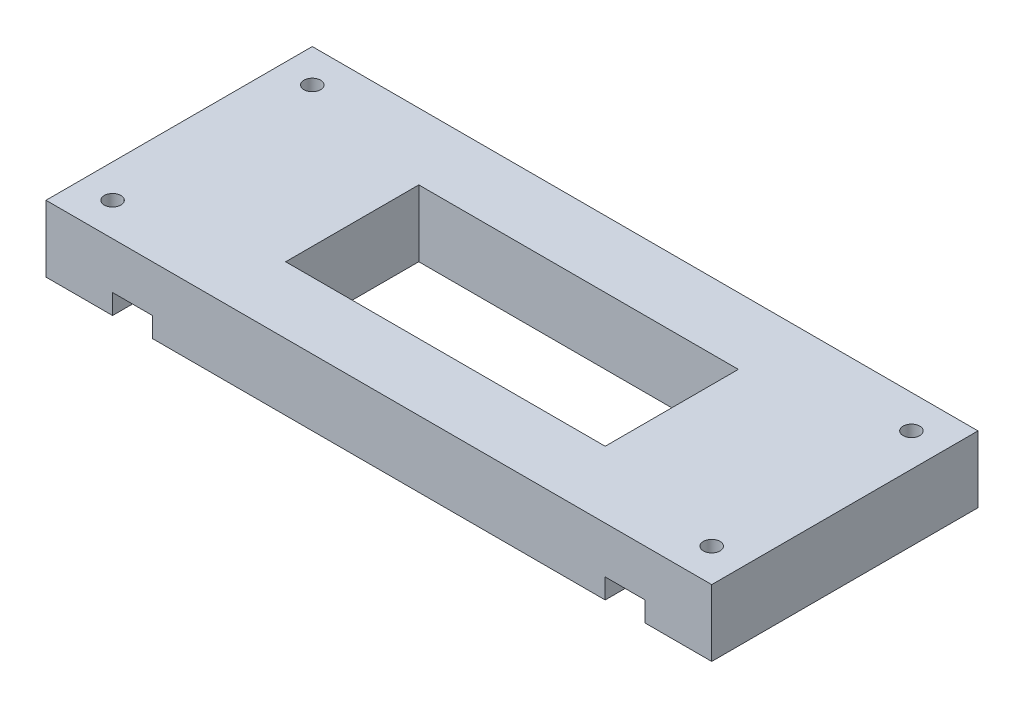
ISO-10303-21;
HEADER;
FILE_DESCRIPTION(('STEP AP214'),'2;1');
FILE_NAME('part.step','',(''),(''),'','','');
FILE_SCHEMA(('AUTOMOTIVE_DESIGN { 1 0 10303 214 1 1 1 1 }'));
ENDSEC;
DATA;
#1=APPLICATION_CONTEXT('core data for automotive mechanical design processes');
#2=APPLICATION_PROTOCOL_DEFINITION('international standard','automotive_design',2000,#1);
#3=PRODUCT_CONTEXT('',#1,'mechanical');
#4=PRODUCT('Part','Part','',(#3));
#5=PRODUCT_RELATED_PRODUCT_CATEGORY('part','',(#4));
#6=PRODUCT_DEFINITION_FORMATION('','',#4);
#7=PRODUCT_DEFINITION_CONTEXT('part definition',#1,'design');
#8=PRODUCT_DEFINITION('design','',#6,#7);
#9=PRODUCT_DEFINITION_SHAPE('','',#8);
#10=(LENGTH_UNIT() NAMED_UNIT(*) SI_UNIT(.MILLI.,.METRE.));
#11=(NAMED_UNIT(*) PLANE_ANGLE_UNIT() SI_UNIT($,.RADIAN.));
#12=(NAMED_UNIT(*) SI_UNIT($,.STERADIAN.) SOLID_ANGLE_UNIT());
#13=UNCERTAINTY_MEASURE_WITH_UNIT(LENGTH_MEASURE(1.E-05),#10,'distance_accuracy_value','');
#14=(GEOMETRIC_REPRESENTATION_CONTEXT(3) GLOBAL_UNCERTAINTY_ASSIGNED_CONTEXT((#13)) GLOBAL_UNIT_ASSIGNED_CONTEXT((#10,
#11,#12)) REPRESENTATION_CONTEXT('',''));
#15=CARTESIAN_POINT('',(0.,0.,0.));
#16=DIRECTION('',(0.,0.,1.));
#17=DIRECTION('',(1.,0.,0.));
#18=AXIS2_PLACEMENT_3D('',#15,#16,#17);
#19=CARTESIAN_POINT('',(0.,10.,40.));
#20=DIRECTION('',(1.,0.,0.));
#21=DIRECTION('',(0.,1.,0.));
#22=AXIS2_PLACEMENT_3D('',#19,#20,#21);
#23=PLANE('',#22);
#24=DIRECTION('',(0.,-1.,0.));
#25=VECTOR('',#24,1.);
#26=CARTESIAN_POINT('',(0.,10.,0.));
#27=LINE('',#26,#25);
#28=CARTESIAN_POINT('',(0.,10.,0.));
#29=VERTEX_POINT('',#28);
#30=CARTESIAN_POINT('',(0.,0.,0.));
#31=VERTEX_POINT('',#30);
#32=EDGE_CURVE('E168',#29,#31,#27,.T.);
#33=ORIENTED_EDGE('',*,*,#32,.T.);
#34=DIRECTION('',(0.,0.,-1.));
#35=VECTOR('',#34,1.);
#36=CARTESIAN_POINT('',(0.,0.,40.));
#37=LINE('',#36,#35);
#38=CARTESIAN_POINT('',(0.,0.,40.));
#39=VERTEX_POINT('',#38);
#40=EDGE_CURVE('E11',#39,#31,#37,.T.);
#41=ORIENTED_EDGE('',*,*,#40,.F.);
#42=DIRECTION('',(0.,-1.,0.));
#43=VECTOR('',#42,1.);
#44=CARTESIAN_POINT('',(0.,10.,40.));
#45=LINE('',#44,#43);
#46=CARTESIAN_POINT('',(0.,10.,40.));
#47=VERTEX_POINT('',#46);
#48=EDGE_CURVE('E200',#47,#39,#45,.T.);
#49=ORIENTED_EDGE('',*,*,#48,.F.);
#50=DIRECTION('',(0.,0.,-1.));
#51=VECTOR('',#50,1.);
#52=CARTESIAN_POINT('',(0.,10.,40.));
#53=LINE('',#52,#51);
#54=EDGE_CURVE('E238',#47,#29,#53,.T.);
#55=ORIENTED_EDGE('',*,*,#54,.T.);
#56=EDGE_LOOP('',(#33,#41,#49,#55));
#57=FACE_BOUND('',#56,.T.);
#58=ADVANCED_FACE('F39',(#57),#23,.F.);
#59=CARTESIAN_POINT('',(0.,0.,40.));
#60=DIRECTION('',(0.,1.,0.));
#61=DIRECTION('',(0.,0.,1.));
#62=AXIS2_PLACEMENT_3D('',#59,#60,#61);
#63=PLANE('',#62);
#64=CARTESIAN_POINT('',(5.,0.,5.));
#65=DIRECTION('',(0.,-1.,0.));
#66=DIRECTION('',(0.,0.,-1.));
#67=AXIS2_PLACEMENT_3D('',#64,#65,#66);
#68=CIRCLE('',#67,1.25);
#69=CARTESIAN_POINT('',(5.,0.,3.75));
#70=VERTEX_POINT('',#69);
#71=EDGE_CURVE('E557',#70,#70,#68,.T.);
#72=ORIENTED_EDGE('',*,*,#71,.F.);
#73=EDGE_LOOP('',(#72));
#74=FACE_BOUND('',#73,.T.);
#75=CARTESIAN_POINT('',(5.,0.,35.));
#76=DIRECTION('',(0.,-1.,0.));
#77=DIRECTION('',(0.,0.,-1.));
#78=AXIS2_PLACEMENT_3D('',#75,#76,#77);
#79=CIRCLE('',#78,1.25);
#80=CARTESIAN_POINT('',(5.,0.,33.75));
#81=VERTEX_POINT('',#80);
#82=EDGE_CURVE('E562',#81,#81,#79,.T.);
#83=ORIENTED_EDGE('',*,*,#82,.F.);
#84=EDGE_LOOP('',(#83));
#85=FACE_BOUND('',#84,.T.);
#86=DIRECTION('',(1.,0.,0.));
#87=VECTOR('',#86,1.);
#88=CARTESIAN_POINT('',(0.,0.,0.));
#89=LINE('',#88,#87);
#90=CARTESIAN_POINT('',(10.,0.,0.));
#91=VERTEX_POINT('',#90);
#92=EDGE_CURVE('E242',#31,#91,#89,.T.);
#93=ORIENTED_EDGE('',*,*,#92,.T.);
#94=DIRECTION('',(0.,0.,-1.));
#95=VECTOR('',#94,1.);
#96=CARTESIAN_POINT('',(10.,0.,40.));
#97=LINE('',#96,#95);
#98=CARTESIAN_POINT('',(10.,0.,40.));
#99=VERTEX_POINT('',#98);
#100=EDGE_CURVE('E47',#99,#91,#97,.T.);
#101=ORIENTED_EDGE('',*,*,#100,.F.);
#102=DIRECTION('',(1.,0.,0.));
#103=VECTOR('',#102,1.);
#104=CARTESIAN_POINT('',(0.,0.,40.));
#105=LINE('',#104,#103);
#106=EDGE_CURVE('E204',#39,#99,#105,.T.);
#107=ORIENTED_EDGE('',*,*,#106,.F.);
#108=ORIENTED_EDGE('',*,*,#40,.T.);
#109=EDGE_LOOP('',(#93,#101,#107,#108));
#110=FACE_BOUND('',#109,.T.);
#111=ADVANCED_FACE('F341',(#74,#85,#110),#63,.F.);
#112=CARTESIAN_POINT('',(10.,0.,40.));
#113=DIRECTION('',(-1.,0.,0.));
#114=DIRECTION('',(0.,0.,1.));
#115=AXIS2_PLACEMENT_3D('',#112,#113,#114);
#116=PLANE('',#115);
#117=DIRECTION('',(0.,1.,0.));
#118=VECTOR('',#117,1.);
#119=CARTESIAN_POINT('',(10.,0.,0.));
#120=LINE('',#119,#118);
#121=CARTESIAN_POINT('',(10.,3.,0.));
#122=VERTEX_POINT('',#121);
#123=EDGE_CURVE('E245',#91,#122,#120,.T.);
#124=ORIENTED_EDGE('',*,*,#123,.T.);
#125=DIRECTION('',(0.,0.,-1.));
#126=VECTOR('',#125,1.);
#127=CARTESIAN_POINT('',(10.,3.,40.));
#128=LINE('',#127,#126);
#129=CARTESIAN_POINT('',(10.,3.,40.));
#130=VERTEX_POINT('',#129);
#131=EDGE_CURVE('E309',#130,#122,#128,.T.);
#132=ORIENTED_EDGE('',*,*,#131,.F.);
#133=DIRECTION('',(0.,1.,0.));
#134=VECTOR('',#133,1.);
#135=CARTESIAN_POINT('',(10.,0.,40.));
#136=LINE('',#135,#134);
#137=EDGE_CURVE('E208',#99,#130,#136,.T.);
#138=ORIENTED_EDGE('',*,*,#137,.F.);
#139=ORIENTED_EDGE('',*,*,#100,.T.);
#140=EDGE_LOOP('',(#124,#132,#138,#139));
#141=FACE_BOUND('',#140,.T.);
#142=ADVANCED_FACE('F318',(#141),#116,.F.);
#143=CARTESIAN_POINT('',(10.,3.,40.));
#144=DIRECTION('',(0.,1.,0.));
#145=DIRECTION('',(0.,0.,1.));
#146=AXIS2_PLACEMENT_3D('',#143,#144,#145);
#147=PLANE('',#146);
#148=DIRECTION('',(1.,0.,0.));
#149=VECTOR('',#148,1.);
#150=CARTESIAN_POINT('',(10.,3.,0.));
#151=LINE('',#150,#149);
#152=CARTESIAN_POINT('',(16.,3.,0.));
#153=VERTEX_POINT('',#152);
#154=EDGE_CURVE('E248',#122,#153,#151,.T.);
#155=ORIENTED_EDGE('',*,*,#154,.T.);
#156=DIRECTION('',(0.,0.,-1.));
#157=VECTOR('',#156,1.);
#158=CARTESIAN_POINT('',(16.,3.,40.));
#159=LINE('',#158,#157);
#160=CARTESIAN_POINT('',(16.,3.,40.));
#161=VERTEX_POINT('',#160);
#162=EDGE_CURVE('E305',#161,#153,#159,.T.);
#163=ORIENTED_EDGE('',*,*,#162,.F.);
#164=DIRECTION('',(1.,0.,0.));
#165=VECTOR('',#164,1.);
#166=CARTESIAN_POINT('',(10.,3.,40.));
#167=LINE('',#166,#165);
#168=EDGE_CURVE('E211',#130,#161,#167,.T.);
#169=ORIENTED_EDGE('',*,*,#168,.F.);
#170=ORIENTED_EDGE('',*,*,#131,.T.);
#171=EDGE_LOOP('',(#155,#163,#169,#170));
#172=FACE_BOUND('',#171,.T.);
#173=ADVANCED_FACE('F329',(#172),#147,.F.);
#174=CARTESIAN_POINT('',(16.,3.,40.));
#175=DIRECTION('',(1.,0.,0.));
#176=DIRECTION('',(0.,0.,-1.));
#177=AXIS2_PLACEMENT_3D('',#174,#175,#176);
#178=PLANE('',#177);
#179=DIRECTION('',(0.,-1.,0.));
#180=VECTOR('',#179,1.);
#181=CARTESIAN_POINT('',(16.,3.,0.));
#182=LINE('',#181,#180);
#183=CARTESIAN_POINT('',(16.,0.,0.));
#184=VERTEX_POINT('',#183);
#185=EDGE_CURVE('E251',#153,#184,#182,.T.);
#186=ORIENTED_EDGE('',*,*,#185,.T.);
#187=DIRECTION('',(0.,0.,-1.));
#188=VECTOR('',#187,1.);
#189=CARTESIAN_POINT('',(16.,0.,40.));
#190=LINE('',#189,#188);
#191=CARTESIAN_POINT('',(16.,0.,40.));
#192=VERTEX_POINT('',#191);
#193=EDGE_CURVE('E301',#192,#184,#190,.T.);
#194=ORIENTED_EDGE('',*,*,#193,.F.);
#195=DIRECTION('',(0.,-1.,0.));
#196=VECTOR('',#195,1.);
#197=CARTESIAN_POINT('',(16.,3.,40.));
#198=LINE('',#197,#196);
#199=EDGE_CURVE('E214',#161,#192,#198,.T.);
#200=ORIENTED_EDGE('',*,*,#199,.F.);
#201=ORIENTED_EDGE('',*,*,#162,.T.);
#202=EDGE_LOOP('',(#186,#194,#200,#201));
#203=FACE_BOUND('',#202,.T.);
#204=ADVANCED_FACE('F333',(#203),#178,.F.);
#205=CARTESIAN_POINT('',(16.,0.,40.));
#206=DIRECTION('',(0.,1.,0.));
#207=DIRECTION('',(0.,0.,1.));
#208=AXIS2_PLACEMENT_3D('',#205,#206,#207);
#209=PLANE('',#208);
#210=DIRECTION('',(1.,0.,0.));
#211=VECTOR('',#210,1.);
#212=CARTESIAN_POINT('',(26.,0.,10.));
#213=LINE('',#212,#211);
#214=CARTESIAN_POINT('',(26.,0.,10.));
#215=VERTEX_POINT('',#214);
#216=CARTESIAN_POINT('',(74.,0.,10.));
#217=VERTEX_POINT('',#216);
#218=EDGE_CURVE('E174',#215,#217,#213,.T.);
#219=ORIENTED_EDGE('',*,*,#218,.F.);
#220=DIRECTION('',(0.,0.,-1.));
#221=VECTOR('',#220,1.);
#222=CARTESIAN_POINT('',(26.,0.,10.));
#223=LINE('',#222,#221);
#224=CARTESIAN_POINT('',(26.,0.,30.));
#225=VERTEX_POINT('',#224);
#226=EDGE_CURVE('E154',#225,#215,#223,.T.);
#227=ORIENTED_EDGE('',*,*,#226,.F.);
#228=DIRECTION('',(-1.,0.,0.));
#229=VECTOR('',#228,1.);
#230=CARTESIAN_POINT('',(26.,0.,30.));
#231=LINE('',#230,#229);
#232=CARTESIAN_POINT('',(74.,0.,30.));
#233=VERTEX_POINT('',#232);
#234=EDGE_CURVE('E164',#233,#225,#231,.T.);
#235=ORIENTED_EDGE('',*,*,#234,.F.);
#236=DIRECTION('',(0.,0.,1.));
#237=VECTOR('',#236,1.);
#238=CARTESIAN_POINT('',(74.,0.,10.));
#239=LINE('',#238,#237);
#240=EDGE_CURVE('E54',#217,#233,#239,.T.);
#241=ORIENTED_EDGE('',*,*,#240,.F.);
#242=EDGE_LOOP('',(#219,#227,#235,#241));
#243=FACE_BOUND('',#242,.T.);
#244=DIRECTION('',(1.,0.,0.));
#245=VECTOR('',#244,1.);
#246=CARTESIAN_POINT('',(16.,0.,0.));
#247=LINE('',#246,#245);
#248=CARTESIAN_POINT('',(84.,0.,0.));
#249=VERTEX_POINT('',#248);
#250=EDGE_CURVE('E254',#184,#249,#247,.T.);
#251=ORIENTED_EDGE('',*,*,#250,.T.);
#252=DIRECTION('',(0.,0.,-1.));
#253=VECTOR('',#252,1.);
#254=CARTESIAN_POINT('',(84.,0.,40.));
#255=LINE('',#254,#253);
#256=CARTESIAN_POINT('',(84.,0.,40.));
#257=VERTEX_POINT('',#256);
#258=EDGE_CURVE('E297',#257,#249,#255,.T.);
#259=ORIENTED_EDGE('',*,*,#258,.F.);
#260=DIRECTION('',(1.,0.,0.));
#261=VECTOR('',#260,1.);
#262=CARTESIAN_POINT('',(16.,0.,40.));
#263=LINE('',#262,#261);
#264=EDGE_CURVE('E217',#192,#257,#263,.T.);
#265=ORIENTED_EDGE('',*,*,#264,.F.);
#266=ORIENTED_EDGE('',*,*,#193,.T.);
#267=EDGE_LOOP('',(#251,#259,#265,#266));
#268=FACE_BOUND('',#267,.T.);
#269=ADVANCED_FACE('F171',(#243,#268),#209,.F.);
#270=CARTESIAN_POINT('',(84.,0.,40.));
#271=DIRECTION('',(-1.,0.,0.));
#272=DIRECTION('',(0.,0.,1.));
#273=AXIS2_PLACEMENT_3D('',#270,#271,#272);
#274=PLANE('',#273);
#275=DIRECTION('',(0.,1.,0.));
#276=VECTOR('',#275,1.);
#277=CARTESIAN_POINT('',(84.,0.,0.));
#278=LINE('',#277,#276);
#279=CARTESIAN_POINT('',(84.,3.,0.));
#280=VERTEX_POINT('',#279);
#281=EDGE_CURVE('E257',#249,#280,#278,.T.);
#282=ORIENTED_EDGE('',*,*,#281,.T.);
#283=DIRECTION('',(0.,0.,-1.));
#284=VECTOR('',#283,1.);
#285=CARTESIAN_POINT('',(84.,3.,40.));
#286=LINE('',#285,#284);
#287=CARTESIAN_POINT('',(84.,3.,40.));
#288=VERTEX_POINT('',#287);
#289=EDGE_CURVE('E293',#288,#280,#286,.T.);
#290=ORIENTED_EDGE('',*,*,#289,.F.);
#291=DIRECTION('',(0.,1.,0.));
#292=VECTOR('',#291,1.);
#293=CARTESIAN_POINT('',(84.,0.,40.));
#294=LINE('',#293,#292);
#295=EDGE_CURVE('E220',#257,#288,#294,.T.);
#296=ORIENTED_EDGE('',*,*,#295,.F.);
#297=ORIENTED_EDGE('',*,*,#258,.T.);
#298=EDGE_LOOP('',(#282,#290,#296,#297));
#299=FACE_BOUND('',#298,.T.);
#300=ADVANCED_FACE('F372',(#299),#274,.F.);
#301=CARTESIAN_POINT('',(84.,3.,40.));
#302=DIRECTION('',(0.,1.,0.));
#303=DIRECTION('',(-1.,0.,0.));
#304=AXIS2_PLACEMENT_3D('',#301,#302,#303);
#305=PLANE('',#304);
#306=DIRECTION('',(1.,0.,0.));
#307=VECTOR('',#306,1.);
#308=CARTESIAN_POINT('',(84.,3.,0.));
#309=LINE('',#308,#307);
#310=CARTESIAN_POINT('',(90.,3.,0.));
#311=VERTEX_POINT('',#310);
#312=EDGE_CURVE('E260',#280,#311,#309,.T.);
#313=ORIENTED_EDGE('',*,*,#312,.T.);
#314=DIRECTION('',(0.,0.,-1.));
#315=VECTOR('',#314,1.);
#316=CARTESIAN_POINT('',(90.,3.,40.));
#317=LINE('',#316,#315);
#318=CARTESIAN_POINT('',(90.,3.,40.));
#319=VERTEX_POINT('',#318);
#320=EDGE_CURVE('E289',#319,#311,#317,.T.);
#321=ORIENTED_EDGE('',*,*,#320,.F.);
#322=DIRECTION('',(1.,0.,0.));
#323=VECTOR('',#322,1.);
#324=CARTESIAN_POINT('',(84.,3.,40.));
#325=LINE('',#324,#323);
#326=EDGE_CURVE('E223',#288,#319,#325,.T.);
#327=ORIENTED_EDGE('',*,*,#326,.F.);
#328=ORIENTED_EDGE('',*,*,#289,.T.);
#329=EDGE_LOOP('',(#313,#321,#327,#328));
#330=FACE_BOUND('',#329,.T.);
#331=ADVANCED_FACE('F368',(#330),#305,.F.);
#332=CARTESIAN_POINT('',(90.,3.,40.));
#333=DIRECTION('',(1.,0.,0.));
#334=DIRECTION('',(0.,0.,-1.));
#335=AXIS2_PLACEMENT_3D('',#332,#333,#334);
#336=PLANE('',#335);
#337=DIRECTION('',(0.,-1.,0.));
#338=VECTOR('',#337,1.);
#339=CARTESIAN_POINT('',(90.,3.,0.));
#340=LINE('',#339,#338);
#341=CARTESIAN_POINT('',(90.,0.,0.));
#342=VERTEX_POINT('',#341);
#343=EDGE_CURVE('E263',#311,#342,#340,.T.);
#344=ORIENTED_EDGE('',*,*,#343,.T.);
#345=DIRECTION('',(0.,0.,-1.));
#346=VECTOR('',#345,1.);
#347=CARTESIAN_POINT('',(90.,0.,40.));
#348=LINE('',#347,#346);
#349=CARTESIAN_POINT('',(90.,0.,40.));
#350=VERTEX_POINT('',#349);
#351=EDGE_CURVE('E285',#350,#342,#348,.T.);
#352=ORIENTED_EDGE('',*,*,#351,.F.);
#353=DIRECTION('',(0.,-1.,0.));
#354=VECTOR('',#353,1.);
#355=CARTESIAN_POINT('',(90.,3.,40.));
#356=LINE('',#355,#354);
#357=EDGE_CURVE('E226',#319,#350,#356,.T.);
#358=ORIENTED_EDGE('',*,*,#357,.F.);
#359=ORIENTED_EDGE('',*,*,#320,.T.);
#360=EDGE_LOOP('',(#344,#352,#358,#359));
#361=FACE_BOUND('',#360,.T.);
#362=ADVANCED_FACE('F363',(#361),#336,.F.);
#363=CARTESIAN_POINT('',(90.,0.,40.));
#364=DIRECTION('',(0.,1.,0.));
#365=DIRECTION('',(0.,0.,1.));
#366=AXIS2_PLACEMENT_3D('',#363,#364,#365);
#367=PLANE('',#366);
#368=CARTESIAN_POINT('',(95.,0.,35.));
#369=DIRECTION('',(0.,-1.,0.));
#370=DIRECTION('',(0.,0.,-1.));
#371=AXIS2_PLACEMENT_3D('',#368,#369,#370);
#372=CIRCLE('',#371,1.25);
#373=CARTESIAN_POINT('',(95.,0.,33.75));
#374=VERTEX_POINT('',#373);
#375=EDGE_CURVE('E573',#374,#374,#372,.T.);
#376=ORIENTED_EDGE('',*,*,#375,.F.);
#377=EDGE_LOOP('',(#376));
#378=FACE_BOUND('',#377,.T.);
#379=CARTESIAN_POINT('',(95.,0.,5.));
#380=DIRECTION('',(0.,-1.,0.));
#381=DIRECTION('',(0.,0.,-1.));
#382=AXIS2_PLACEMENT_3D('',#379,#380,#381);
#383=CIRCLE('',#382,1.25);
#384=CARTESIAN_POINT('',(95.,0.,3.75));
#385=VERTEX_POINT('',#384);
#386=EDGE_CURVE('E598',#385,#385,#383,.T.);
#387=ORIENTED_EDGE('',*,*,#386,.F.);
#388=EDGE_LOOP('',(#387));
#389=FACE_BOUND('',#388,.T.);
#390=DIRECTION('',(1.,0.,0.));
#391=VECTOR('',#390,1.);
#392=CARTESIAN_POINT('',(90.,0.,0.));
#393=LINE('',#392,#391);
#394=CARTESIAN_POINT('',(100.,0.,0.));
#395=VERTEX_POINT('',#394);
#396=EDGE_CURVE('E266',#342,#395,#393,.T.);
#397=ORIENTED_EDGE('',*,*,#396,.T.);
#398=DIRECTION('',(0.,0.,-1.));
#399=VECTOR('',#398,1.);
#400=CARTESIAN_POINT('',(100.,0.,40.));
#401=LINE('',#400,#399);
#402=CARTESIAN_POINT('',(100.,0.,40.));
#403=VERTEX_POINT('',#402);
#404=EDGE_CURVE('E281',#403,#395,#401,.T.);
#405=ORIENTED_EDGE('',*,*,#404,.F.);
#406=DIRECTION('',(1.,0.,0.));
#407=VECTOR('',#406,1.);
#408=CARTESIAN_POINT('',(90.,0.,40.));
#409=LINE('',#408,#407);
#410=EDGE_CURVE('E229',#350,#403,#409,.T.);
#411=ORIENTED_EDGE('',*,*,#410,.F.);
#412=ORIENTED_EDGE('',*,*,#351,.T.);
#413=EDGE_LOOP('',(#397,#405,#411,#412));
#414=FACE_BOUND('',#413,.T.);
#415=ADVANCED_FACE('F357',(#378,#389,#414),#367,.F.);
#416=CARTESIAN_POINT('',(100.,10.,40.));
#417=DIRECTION('',(-1.,0.,0.));
#418=DIRECTION('',(0.,0.,1.));
#419=AXIS2_PLACEMENT_3D('',#416,#417,#418);
#420=PLANE('',#419);
#421=DIRECTION('',(0.,1.,0.));
#422=VECTOR('',#421,1.);
#423=CARTESIAN_POINT('',(100.,10.,0.));
#424=LINE('',#423,#422);
#425=CARTESIAN_POINT('',(100.,10.,0.));
#426=VERTEX_POINT('',#425);
#427=EDGE_CURVE('E269',#395,#426,#424,.T.);
#428=ORIENTED_EDGE('',*,*,#427,.T.);
#429=DIRECTION('',(0.,0.,-1.));
#430=VECTOR('',#429,1.);
#431=CARTESIAN_POINT('',(100.,10.,40.));
#432=LINE('',#431,#430);
#433=CARTESIAN_POINT('',(100.,10.,40.));
#434=VERTEX_POINT('',#433);
#435=EDGE_CURVE('E277',#434,#426,#432,.T.);
#436=ORIENTED_EDGE('',*,*,#435,.F.);
#437=DIRECTION('',(0.,1.,0.));
#438=VECTOR('',#437,1.);
#439=CARTESIAN_POINT('',(100.,10.,40.));
#440=LINE('',#439,#438);
#441=EDGE_CURVE('E232',#403,#434,#440,.T.);
#442=ORIENTED_EDGE('',*,*,#441,.F.);
#443=ORIENTED_EDGE('',*,*,#404,.T.);
#444=EDGE_LOOP('',(#428,#436,#442,#443));
#445=FACE_BOUND('',#444,.T.);
#446=ADVANCED_FACE('F353',(#445),#420,.F.);
#447=CARTESIAN_POINT('',(0.,10.,40.));
#448=DIRECTION('',(0.,-1.,0.));
#449=DIRECTION('',(0.,0.,-1.));
#450=AXIS2_PLACEMENT_3D('',#447,#448,#449);
#451=PLANE('',#450);
#452=CARTESIAN_POINT('',(5.,10.,5.));
#453=DIRECTION('',(0.,-1.,0.));
#454=DIRECTION('',(0.,0.,-1.));
#455=AXIS2_PLACEMENT_3D('',#452,#453,#454);
#456=CIRCLE('',#455,1.25);
#457=CARTESIAN_POINT('',(5.,10.,3.75));
#458=VERTEX_POINT('',#457);
#459=EDGE_CURVE('E560',#458,#458,#456,.F.);
#460=ORIENTED_EDGE('',*,*,#459,.F.);
#461=EDGE_LOOP('',(#460));
#462=FACE_BOUND('',#461,.T.);
#463=CARTESIAN_POINT('',(95.,10.,35.));
#464=DIRECTION('',(0.,-1.,0.));
#465=DIRECTION('',(0.,0.,-1.));
#466=AXIS2_PLACEMENT_3D('',#463,#464,#465);
#467=CIRCLE('',#466,1.25);
#468=CARTESIAN_POINT('',(95.,10.,33.75));
#469=VERTEX_POINT('',#468);
#470=EDGE_CURVE('E569',#469,#469,#467,.F.);
#471=ORIENTED_EDGE('',*,*,#470,.F.);
#472=EDGE_LOOP('',(#471));
#473=FACE_BOUND('',#472,.T.);
#474=CARTESIAN_POINT('',(95.,10.,5.));
#475=DIRECTION('',(0.,-1.,0.));
#476=DIRECTION('',(0.,0.,-1.));
#477=AXIS2_PLACEMENT_3D('',#474,#475,#476);
#478=CIRCLE('',#477,1.25);
#479=CARTESIAN_POINT('',(95.,10.,3.75));
#480=VERTEX_POINT('',#479);
#481=EDGE_CURVE('E577',#480,#480,#478,.F.);
#482=ORIENTED_EDGE('',*,*,#481,.F.);
#483=EDGE_LOOP('',(#482));
#484=FACE_BOUND('',#483,.T.);
#485=CARTESIAN_POINT('',(5.,10.,35.));
#486=DIRECTION('',(0.,-1.,0.));
#487=DIRECTION('',(0.,0.,-1.));
#488=AXIS2_PLACEMENT_3D('',#485,#486,#487);
#489=CIRCLE('',#488,1.25);
#490=CARTESIAN_POINT('',(5.,10.,33.75));
#491=VERTEX_POINT('',#490);
#492=EDGE_CURVE('E567',#491,#491,#489,.F.);
#493=ORIENTED_EDGE('',*,*,#492,.F.);
#494=EDGE_LOOP('',(#493));
#495=FACE_BOUND('',#494,.T.);
#496=DIRECTION('',(1.,0.,0.));
#497=VECTOR('',#496,1.);
#498=CARTESIAN_POINT('',(26.,10.,30.));
#499=LINE('',#498,#497);
#500=CARTESIAN_POINT('',(26.,10.,30.));
#501=VERTEX_POINT('',#500);
#502=CARTESIAN_POINT('',(74.,10.,30.));
#503=VERTEX_POINT('',#502);
#504=EDGE_CURVE('E179',#501,#503,#499,.T.);
#505=ORIENTED_EDGE('',*,*,#504,.F.);
#506=DIRECTION('',(0.,0.,1.));
#507=VECTOR('',#506,1.);
#508=CARTESIAN_POINT('',(26.,10.,10.));
#509=LINE('',#508,#507);
#510=CARTESIAN_POINT('',(26.,10.,10.));
#511=VERTEX_POINT('',#510);
#512=EDGE_CURVE('E62',#511,#501,#509,.T.);
#513=ORIENTED_EDGE('',*,*,#512,.F.);
#514=DIRECTION('',(-1.,0.,0.));
#515=VECTOR('',#514,1.);
#516=CARTESIAN_POINT('',(26.,10.,10.));
#517=LINE('',#516,#515);
#518=CARTESIAN_POINT('',(74.,10.,10.));
#519=VERTEX_POINT('',#518);
#520=EDGE_CURVE('E161',#519,#511,#517,.T.);
#521=ORIENTED_EDGE('',*,*,#520,.F.);
#522=DIRECTION('',(0.,0.,-1.));
#523=VECTOR('',#522,1.);
#524=CARTESIAN_POINT('',(74.,10.,10.));
#525=LINE('',#524,#523);
#526=EDGE_CURVE('E186',#503,#519,#525,.T.);
#527=ORIENTED_EDGE('',*,*,#526,.F.);
#528=EDGE_LOOP('',(#505,#513,#521,#527));
#529=FACE_BOUND('',#528,.T.);
#530=DIRECTION('',(-1.,0.,0.));
#531=VECTOR('',#530,1.);
#532=CARTESIAN_POINT('',(0.,10.,0.));
#533=LINE('',#532,#531);
#534=EDGE_CURVE('E205',#426,#29,#533,.T.);
#535=ORIENTED_EDGE('',*,*,#534,.T.);
#536=ORIENTED_EDGE('',*,*,#54,.F.);
#537=DIRECTION('',(-1.,0.,0.));
#538=VECTOR('',#537,1.);
#539=CARTESIAN_POINT('',(0.,10.,40.));
#540=LINE('',#539,#538);
#541=EDGE_CURVE('E235',#434,#47,#540,.T.);
#542=ORIENTED_EDGE('',*,*,#541,.F.);
#543=ORIENTED_EDGE('',*,*,#435,.T.);
#544=EDGE_LOOP('',(#535,#536,#542,#543));
#545=FACE_BOUND('',#544,.T.);
#546=ADVANCED_FACE('F348',(#462,#473,#484,#495,#529,#545),#451,.F.);
#547=CARTESIAN_POINT('',(0.,0.,40.));
#548=DIRECTION('',(0.,0.,1.));
#549=DIRECTION('',(1.,0.,0.));
#550=AXIS2_PLACEMENT_3D('',#547,#548,#549);
#551=PLANE('',#550);
#552=ORIENTED_EDGE('',*,*,#48,.T.);
#553=ORIENTED_EDGE('',*,*,#106,.T.);
#554=ORIENTED_EDGE('',*,*,#137,.T.);
#555=ORIENTED_EDGE('',*,*,#168,.T.);
#556=ORIENTED_EDGE('',*,*,#199,.T.);
#557=ORIENTED_EDGE('',*,*,#264,.T.);
#558=ORIENTED_EDGE('',*,*,#295,.T.);
#559=ORIENTED_EDGE('',*,*,#326,.T.);
#560=ORIENTED_EDGE('',*,*,#357,.T.);
#561=ORIENTED_EDGE('',*,*,#410,.T.);
#562=ORIENTED_EDGE('',*,*,#441,.T.);
#563=ORIENTED_EDGE('',*,*,#541,.T.);
#564=EDGE_LOOP('',(#552,#553,#554,#555,#556,#557,#558,#559,#560,#561,#562,#563));
#565=FACE_BOUND('',#564,.T.);
#566=ADVANCED_FACE('F337',(#565),#551,.T.);
#567=CARTESIAN_POINT('',(0.,0.,0.));
#568=DIRECTION('',(0.,0.,1.));
#569=DIRECTION('',(1.,0.,0.));
#570=AXIS2_PLACEMENT_3D('',#567,#568,#569);
#571=PLANE('',#570);
#572=ORIENTED_EDGE('',*,*,#32,.F.);
#573=ORIENTED_EDGE('',*,*,#534,.F.);
#574=ORIENTED_EDGE('',*,*,#427,.F.);
#575=ORIENTED_EDGE('',*,*,#396,.F.);
#576=ORIENTED_EDGE('',*,*,#343,.F.);
#577=ORIENTED_EDGE('',*,*,#312,.F.);
#578=ORIENTED_EDGE('',*,*,#281,.F.);
#579=ORIENTED_EDGE('',*,*,#250,.F.);
#580=ORIENTED_EDGE('',*,*,#185,.F.);
#581=ORIENTED_EDGE('',*,*,#154,.F.);
#582=ORIENTED_EDGE('',*,*,#123,.F.);
#583=ORIENTED_EDGE('',*,*,#92,.F.);
#584=EDGE_LOOP('',(#572,#573,#574,#575,#576,#577,#578,#579,#580,#581,#582,#583));
#585=FACE_BOUND('',#584,.T.);
#586=ADVANCED_FACE('F324',(#585),#571,.F.);
#587=CARTESIAN_POINT('',(26.,-0.000999999999999265,10.));
#588=DIRECTION('',(-1.,0.,0.));
#589=DIRECTION('',(0.,0.,1.));
#590=AXIS2_PLACEMENT_3D('',#587,#588,#589);
#591=PLANE('',#590);
#592=ORIENTED_EDGE('',*,*,#226,.T.);
#593=DIRECTION('',(0.,1.,0.));
#594=VECTOR('',#593,1.);
#595=CARTESIAN_POINT('',(26.,-0.000999999999999265,10.));
#596=LINE('',#595,#594);
#597=EDGE_CURVE('E169',#215,#511,#596,.T.);
#598=ORIENTED_EDGE('',*,*,#597,.T.);
#599=ORIENTED_EDGE('',*,*,#512,.T.);
#600=DIRECTION('',(0.,1.,0.));
#601=VECTOR('',#600,1.);
#602=CARTESIAN_POINT('',(26.,-0.000999999999999265,30.));
#603=LINE('',#602,#601);
#604=EDGE_CURVE('E150',#225,#501,#603,.T.);
#605=ORIENTED_EDGE('',*,*,#604,.F.);
#606=EDGE_LOOP('',(#592,#598,#599,#605));
#607=FACE_BOUND('',#606,.T.);
#608=ADVANCED_FACE('F152',(#607),#591,.F.);
#609=CARTESIAN_POINT('',(26.,-0.000999999999999265,10.));
#610=DIRECTION('',(0.,0.,-1.));
#611=DIRECTION('',(-1.,0.,0.));
#612=AXIS2_PLACEMENT_3D('',#609,#610,#611);
#613=PLANE('',#612);
#614=ORIENTED_EDGE('',*,*,#218,.T.);
#615=DIRECTION('',(0.,1.,0.));
#616=VECTOR('',#615,1.);
#617=CARTESIAN_POINT('',(74.,-0.000999999999999265,10.));
#618=LINE('',#617,#616);
#619=EDGE_CURVE('E195',#217,#519,#618,.T.);
#620=ORIENTED_EDGE('',*,*,#619,.T.);
#621=ORIENTED_EDGE('',*,*,#520,.T.);
#622=ORIENTED_EDGE('',*,*,#597,.F.);
#623=EDGE_LOOP('',(#614,#620,#621,#622));
#624=FACE_BOUND('',#623,.T.);
#625=ADVANCED_FACE('F465',(#624),#613,.F.);
#626=CARTESIAN_POINT('',(74.,-0.000999999999999265,10.));
#627=DIRECTION('',(1.,0.,0.));
#628=DIRECTION('',(0.,0.,-1.));
#629=AXIS2_PLACEMENT_3D('',#626,#627,#628);
#630=PLANE('',#629);
#631=ORIENTED_EDGE('',*,*,#240,.T.);
#632=DIRECTION('',(0.,1.,0.));
#633=VECTOR('',#632,1.);
#634=CARTESIAN_POINT('',(74.,-0.000999999999999265,30.));
#635=LINE('',#634,#633);
#636=EDGE_CURVE('E160',#233,#503,#635,.T.);
#637=ORIENTED_EDGE('',*,*,#636,.T.);
#638=ORIENTED_EDGE('',*,*,#526,.T.);
#639=ORIENTED_EDGE('',*,*,#619,.F.);
#640=EDGE_LOOP('',(#631,#637,#638,#639));
#641=FACE_BOUND('',#640,.T.);
#642=ADVANCED_FACE('F474',(#641),#630,.F.);
#643=CARTESIAN_POINT('',(26.,-0.000999999999999265,30.));
#644=DIRECTION('',(0.,0.,1.));
#645=DIRECTION('',(1.,0.,0.));
#646=AXIS2_PLACEMENT_3D('',#643,#644,#645);
#647=PLANE('',#646);
#648=ORIENTED_EDGE('',*,*,#234,.T.);
#649=ORIENTED_EDGE('',*,*,#604,.T.);
#650=ORIENTED_EDGE('',*,*,#504,.T.);
#651=ORIENTED_EDGE('',*,*,#636,.F.);
#652=EDGE_LOOP('',(#648,#649,#650,#651));
#653=FACE_BOUND('',#652,.T.);
#654=ADVANCED_FACE('F165',(#653),#647,.F.);
#655=CARTESIAN_POINT('',(5.,10.001,35.));
#656=DIRECTION('',(0.,-1.,0.));
#657=DIRECTION('',(0.,0.,-1.));
#658=AXIS2_PLACEMENT_3D('',#655,#656,#657);
#659=CYLINDRICAL_SURFACE('',#658,1.25);
#660=ORIENTED_EDGE('',*,*,#82,.T.);
#661=EDGE_LOOP('',(#660));
#662=FACE_BOUND('',#661,.T.);
#663=ORIENTED_EDGE('',*,*,#492,.T.);
#664=EDGE_LOOP('',(#663));
#665=FACE_BOUND('',#664,.T.);
#666=ADVANCED_FACE('F491',(#662,#665),#659,.F.);
#667=CARTESIAN_POINT('',(95.,10.001,5.));
#668=DIRECTION('',(0.,-1.,0.));
#669=DIRECTION('',(0.,0.,-1.));
#670=AXIS2_PLACEMENT_3D('',#667,#668,#669);
#671=CYLINDRICAL_SURFACE('',#670,1.25);
#672=ORIENTED_EDGE('',*,*,#386,.T.);
#673=EDGE_LOOP('',(#672));
#674=FACE_BOUND('',#673,.T.);
#675=ORIENTED_EDGE('',*,*,#481,.T.);
#676=EDGE_LOOP('',(#675));
#677=FACE_BOUND('',#676,.T.);
#678=ADVANCED_FACE('F521',(#674,#677),#671,.F.);
#679=CARTESIAN_POINT('',(95.,10.001,35.));
#680=DIRECTION('',(0.,-1.,0.));
#681=DIRECTION('',(0.,0.,-1.));
#682=AXIS2_PLACEMENT_3D('',#679,#680,#681);
#683=CYLINDRICAL_SURFACE('',#682,1.25);
#684=ORIENTED_EDGE('',*,*,#375,.T.);
#685=EDGE_LOOP('',(#684));
#686=FACE_BOUND('',#685,.T.);
#687=ORIENTED_EDGE('',*,*,#470,.T.);
#688=EDGE_LOOP('',(#687));
#689=FACE_BOUND('',#688,.T.);
#690=ADVANCED_FACE('F531',(#686,#689),#683,.F.);
#691=CARTESIAN_POINT('',(5.,10.001,5.));
#692=DIRECTION('',(0.,-1.,0.));
#693=DIRECTION('',(0.,0.,-1.));
#694=AXIS2_PLACEMENT_3D('',#691,#692,#693);
#695=CYLINDRICAL_SURFACE('',#694,1.25);
#696=ORIENTED_EDGE('',*,*,#71,.T.);
#697=EDGE_LOOP('',(#696));
#698=FACE_BOUND('',#697,.T.);
#699=ORIENTED_EDGE('',*,*,#459,.T.);
#700=EDGE_LOOP('',(#699));
#701=FACE_BOUND('',#700,.T.);
#702=ADVANCED_FACE('F541',(#698,#701),#695,.F.);
#703=CLOSED_SHELL('',(#58,#111,#142,#173,#204,#269,#300,#331,#362,#415,#446,#546,#566,#586,#608,
#625,#642,#654,#666,#678,#690,#702));
#704=MANIFOLD_SOLID_BREP('B2',#703);
#705=ADVANCED_BREP_SHAPE_REPRESENTATION('',(#18,#704),#14);
#706=SHAPE_DEFINITION_REPRESENTATION(#9,#705);
ENDSEC;
END-ISO-10303-21;
